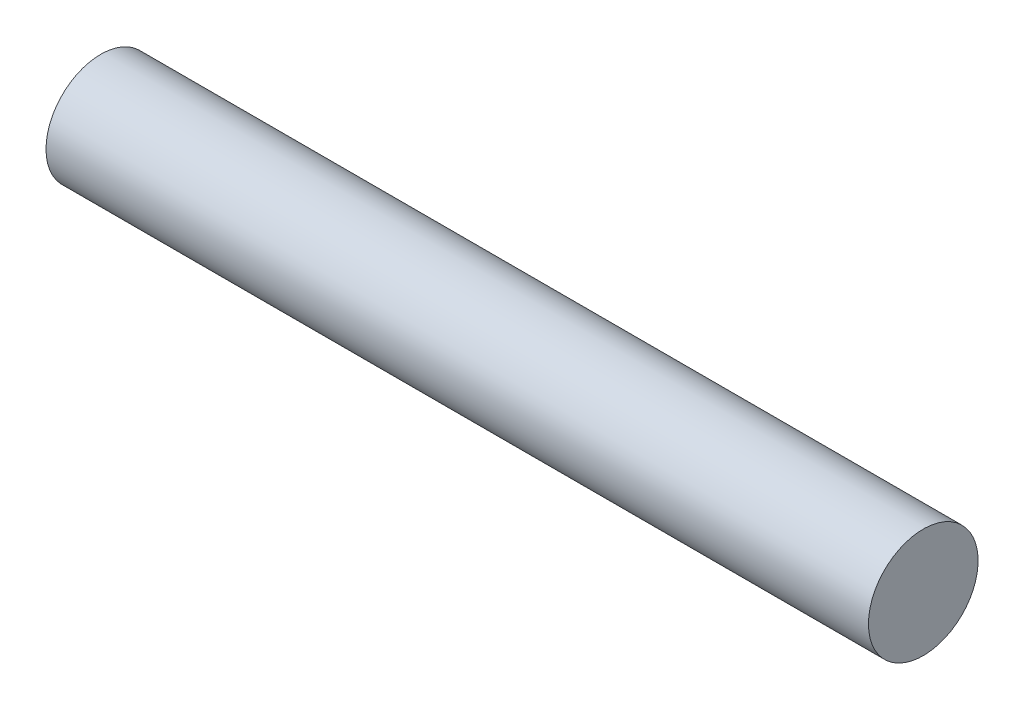
ISO-10303-21;
HEADER;
FILE_DESCRIPTION(('STEP AP214'),'2;1');
FILE_NAME('part.step','',(''),(''),'','','');
FILE_SCHEMA(('AUTOMOTIVE_DESIGN { 1 0 10303 214 1 1 1 1 }'));
ENDSEC;
DATA;
#1=APPLICATION_CONTEXT('core data for automotive mechanical design processes');
#2=APPLICATION_PROTOCOL_DEFINITION('international standard','automotive_design',2000,#1);
#3=PRODUCT_CONTEXT('',#1,'mechanical');
#4=PRODUCT('Part','Part','',(#3));
#5=PRODUCT_RELATED_PRODUCT_CATEGORY('part','',(#4));
#6=PRODUCT_DEFINITION_FORMATION('','',#4);
#7=PRODUCT_DEFINITION_CONTEXT('part definition',#1,'design');
#8=PRODUCT_DEFINITION('design','',#6,#7);
#9=PRODUCT_DEFINITION_SHAPE('','',#8);
#10=(LENGTH_UNIT() NAMED_UNIT(*) SI_UNIT(.MILLI.,.METRE.));
#11=(NAMED_UNIT(*) PLANE_ANGLE_UNIT() SI_UNIT($,.RADIAN.));
#12=(NAMED_UNIT(*) SI_UNIT($,.STERADIAN.) SOLID_ANGLE_UNIT());
#13=UNCERTAINTY_MEASURE_WITH_UNIT(LENGTH_MEASURE(1.E-05),#10,'distance_accuracy_value','');
#14=(GEOMETRIC_REPRESENTATION_CONTEXT(3) GLOBAL_UNCERTAINTY_ASSIGNED_CONTEXT((#13)) GLOBAL_UNIT_ASSIGNED_CONTEXT((#10,
#11,#12)) REPRESENTATION_CONTEXT('',''));
#15=CARTESIAN_POINT('',(0.,0.,0.));
#16=DIRECTION('',(0.,0.,1.));
#17=DIRECTION('',(1.,0.,0.));
#18=AXIS2_PLACEMENT_3D('',#15,#16,#17);
#19=CARTESIAN_POINT('',(-32.6697247706422,2.99999999999999,0.));
#20=DIRECTION('',(1.,0.,0.));
#21=DIRECTION('',(0.,0.,-1.));
#22=AXIS2_PLACEMENT_3D('',#19,#20,#21);
#23=PLANE('',#22);
#24=CARTESIAN_POINT('',(-32.6697247706422,0.,0.));
#25=DIRECTION('',(-1.,0.,0.));
#26=DIRECTION('',(0.,0.,1.));
#27=AXIS2_PLACEMENT_3D('',#24,#25,#26);
#28=CIRCLE('',#27,2.99999999999999);
#29=CARTESIAN_POINT('',(-32.6697247706422,0.,2.99999999999999));
#30=VERTEX_POINT('',#29);
#31=EDGE_CURVE('E37',#30,#30,#28,.T.);
#32=ORIENTED_EDGE('',*,*,#31,.T.);
#33=EDGE_LOOP('',(#32));
#34=FACE_BOUND('',#33,.T.);
#35=ADVANCED_FACE('F31',(#34),#23,.F.);
#36=CARTESIAN_POINT('',(12.3302752293578,0.,0.));
#37=DIRECTION('',(-1.,0.,0.));
#38=DIRECTION('',(0.,0.,1.));
#39=AXIS2_PLACEMENT_3D('',#36,#37,#38);
#40=PLANE('',#39);
#41=CARTESIAN_POINT('',(12.3302752293578,0.,0.));
#42=DIRECTION('',(-1.,0.,0.));
#43=DIRECTION('',(0.,0.,1.));
#44=AXIS2_PLACEMENT_3D('',#41,#42,#43);
#45=CIRCLE('',#44,3.);
#46=CARTESIAN_POINT('',(12.3302752293578,0.,3.));
#47=VERTEX_POINT('',#46);
#48=EDGE_CURVE('E10',#47,#47,#45,.T.);
#49=ORIENTED_EDGE('',*,*,#48,.F.);
#50=EDGE_LOOP('',(#49));
#51=FACE_BOUND('',#50,.T.);
#52=ADVANCED_FACE('F46',(#51),#40,.F.);
#53=CARTESIAN_POINT('',(-32.6697247706422,0.,0.));
#54=DIRECTION('',(-1.,0.,0.));
#55=DIRECTION('',(0.,0.,1.));
#56=AXIS2_PLACEMENT_3D('',#53,#54,#55);
#57=CYLINDRICAL_SURFACE('',#56,3.);
#58=ORIENTED_EDGE('',*,*,#31,.F.);
#59=EDGE_LOOP('',(#58));
#60=FACE_BOUND('',#59,.T.);
#61=ORIENTED_EDGE('',*,*,#48,.T.);
#62=EDGE_LOOP('',(#61));
#63=FACE_BOUND('',#62,.T.);
#64=ADVANCED_FACE('F44',(#60,#63),#57,.T.);
#65=CLOSED_SHELL('',(#35,#52,#64));
#66=MANIFOLD_SOLID_BREP('B2',#65);
#67=ADVANCED_BREP_SHAPE_REPRESENTATION('',(#18,#66),#14);
#68=SHAPE_DEFINITION_REPRESENTATION(#9,#67);
ENDSEC;
END-ISO-10303-21;
